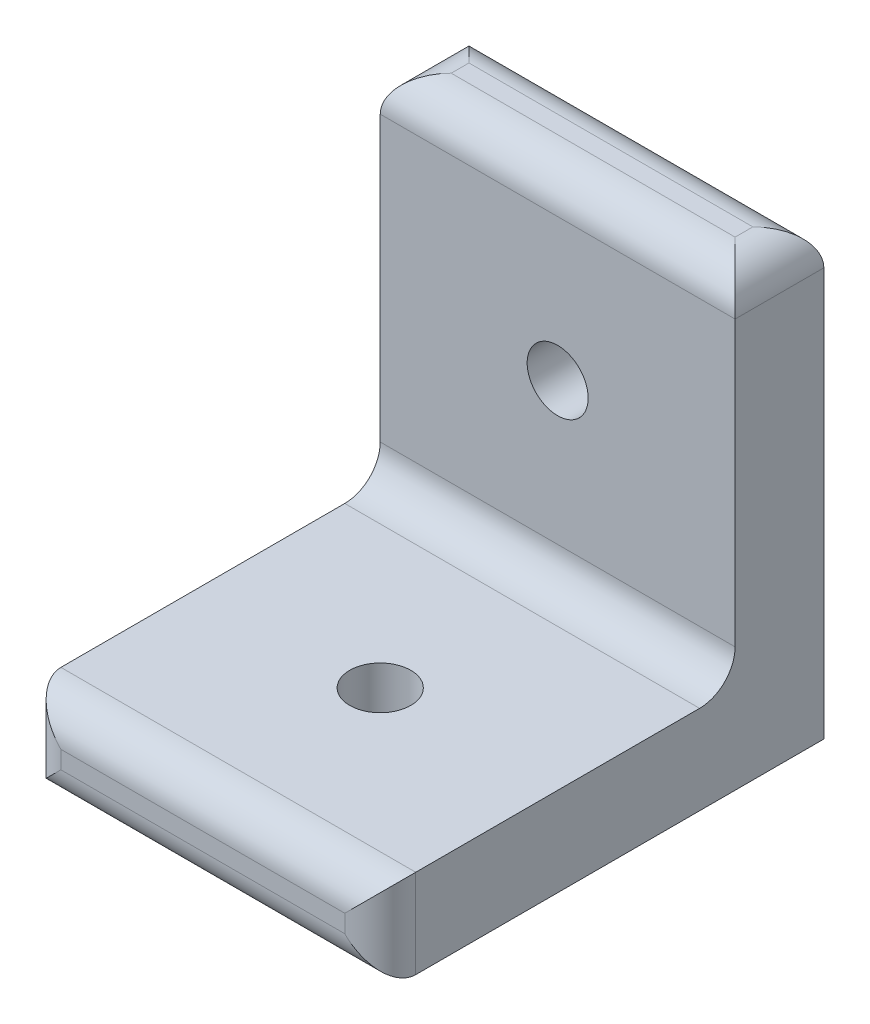
ISO-10303-21;
HEADER;
FILE_DESCRIPTION(('STEP AP214'),'2;1');
FILE_NAME('part.step','',(''),(''),'','','');
FILE_SCHEMA(('AUTOMOTIVE_DESIGN { 1 0 10303 214 1 1 1 1 }'));
ENDSEC;
DATA;
#1=APPLICATION_CONTEXT('core data for automotive mechanical design processes');
#2=APPLICATION_PROTOCOL_DEFINITION('international standard','automotive_design',2000,#1);
#3=PRODUCT_CONTEXT('',#1,'mechanical');
#4=PRODUCT('Part','Part','',(#3));
#5=PRODUCT_RELATED_PRODUCT_CATEGORY('part','',(#4));
#6=PRODUCT_DEFINITION_FORMATION('','',#4);
#7=PRODUCT_DEFINITION_CONTEXT('part definition',#1,'design');
#8=PRODUCT_DEFINITION('design','',#6,#7);
#9=PRODUCT_DEFINITION_SHAPE('','',#8);
#10=(LENGTH_UNIT() NAMED_UNIT(*) SI_UNIT(.MILLI.,.METRE.));
#11=(NAMED_UNIT(*) PLANE_ANGLE_UNIT() SI_UNIT($,.RADIAN.));
#12=(NAMED_UNIT(*) SI_UNIT($,.STERADIAN.) SOLID_ANGLE_UNIT());
#13=UNCERTAINTY_MEASURE_WITH_UNIT(LENGTH_MEASURE(1.E-05),#10,'distance_accuracy_value','');
#14=(GEOMETRIC_REPRESENTATION_CONTEXT(3) GLOBAL_UNCERTAINTY_ASSIGNED_CONTEXT((#13)) GLOBAL_UNIT_ASSIGNED_CONTEXT((#10,
#11,#12)) REPRESENTATION_CONTEXT('',''));
#15=CARTESIAN_POINT('',(0.,0.,0.));
#16=DIRECTION('',(0.,0.,1.));
#17=DIRECTION('',(1.,0.,0.));
#18=AXIS2_PLACEMENT_3D('',#15,#16,#17);
#19=CARTESIAN_POINT('',(0.,0.,-12.7));
#20=DIRECTION('',(0.,0.,-1.));
#21=DIRECTION('',(-1.,0.,0.));
#22=AXIS2_PLACEMENT_3D('',#19,#20,#21);
#23=PLANE('',#22);
#24=DIRECTION('',(0.,-1.,0.));
#25=VECTOR('',#24,1.);
#26=CARTESIAN_POINT('',(12.7,31.75,-12.7));
#27=LINE('',#26,#25);
#28=CARTESIAN_POINT('',(12.7,29.21,-12.7));
#29=VERTEX_POINT('',#28);
#30=CARTESIAN_POINT('',(12.7,8.89,-12.7));
#31=VERTEX_POINT('',#30);
#32=EDGE_CURVE('E154',#29,#31,#27,.T.);
#33=ORIENTED_EDGE('',*,*,#32,.F.);
#34=DIRECTION('',(1.,0.,0.));
#35=VECTOR('',#34,1.);
#36=CARTESIAN_POINT('',(0.,29.21,-12.7));
#37=LINE('',#36,#35);
#38=CARTESIAN_POINT('',(-12.7,29.21,-12.7));
#39=VERTEX_POINT('',#38);
#40=EDGE_CURVE('E193',#29,#39,#37,.F.);
#41=ORIENTED_EDGE('',*,*,#40,.T.);
#42=DIRECTION('',(0.,1.,0.));
#43=VECTOR('',#42,1.);
#44=CARTESIAN_POINT('',(-12.7,31.75,-12.7));
#45=LINE('',#44,#43);
#46=CARTESIAN_POINT('',(-12.7,8.89,-12.7));
#47=VERTEX_POINT('',#46);
#48=EDGE_CURVE('E151',#47,#39,#45,.T.);
#49=ORIENTED_EDGE('',*,*,#48,.F.);
#50=DIRECTION('',(-1.,0.,0.));
#51=VECTOR('',#50,1.);
#52=CARTESIAN_POINT('',(12.7,8.89,-12.7));
#53=LINE('',#52,#51);
#54=EDGE_CURVE('E191',#47,#31,#53,.F.);
#55=ORIENTED_EDGE('',*,*,#54,.T.);
#56=EDGE_LOOP('',(#33,#41,#49,#55));
#57=FACE_BOUND('',#56,.T.);
#58=CARTESIAN_POINT('',(0.,19.05,-12.7));
#59=DIRECTION('',(0.,0.,1.));
#60=DIRECTION('',(1.,0.,0.));
#61=AXIS2_PLACEMENT_3D('',#58,#59,#60);
#62=CIRCLE('',#61,2.182876);
#63=CARTESIAN_POINT('',(2.182876,19.05,-12.7));
#64=VERTEX_POINT('',#63);
#65=EDGE_CURVE('E275',#64,#64,#62,.T.);
#66=ORIENTED_EDGE('',*,*,#65,.F.);
#67=EDGE_LOOP('',(#66));
#68=FACE_BOUND('',#67,.T.);
#69=ADVANCED_FACE('F37',(#57,#68),#23,.F.);
#70=CARTESIAN_POINT('',(12.7,6.35,12.7));
#71=DIRECTION('',(-1.,0.,0.));
#72=DIRECTION('',(0.,0.,1.));
#73=AXIS2_PLACEMENT_3D('',#70,#71,#72);
#74=PLANE('',#73);
#75=DIRECTION('',(0.,-1.,0.));
#76=VECTOR('',#75,1.);
#77=CARTESIAN_POINT('',(12.7,31.75,-19.05));
#78=LINE('',#77,#76);
#79=CARTESIAN_POINT('',(12.7,29.21,-19.05));
#80=VERTEX_POINT('',#79);
#81=CARTESIAN_POINT('',(12.7,0.,-19.05));
#82=VERTEX_POINT('',#81);
#83=EDGE_CURVE('E123',#80,#82,#78,.T.);
#84=ORIENTED_EDGE('',*,*,#83,.F.);
#85=DIRECTION('',(0.,0.,1.));
#86=VECTOR('',#85,1.);
#87=CARTESIAN_POINT('',(12.7,29.21,12.7));
#88=LINE('',#87,#86);
#89=EDGE_CURVE('E181',#80,#29,#88,.T.);
#90=ORIENTED_EDGE('',*,*,#89,.T.);
#91=ORIENTED_EDGE('',*,*,#32,.T.);
#92=CARTESIAN_POINT('',(12.7,8.89,-10.16));
#93=DIRECTION('',(-1.,0.,0.));
#94=DIRECTION('',(0.,0.,1.));
#95=AXIS2_PLACEMENT_3D('',#92,#93,#94);
#96=CIRCLE('',#95,2.54);
#97=CARTESIAN_POINT('',(12.7,6.35,-10.16));
#98=VERTEX_POINT('',#97);
#99=EDGE_CURVE('E11',#31,#98,#96,.T.);
#100=ORIENTED_EDGE('',*,*,#99,.T.);
#101=DIRECTION('',(0.,0.,-1.));
#102=VECTOR('',#101,1.);
#103=CARTESIAN_POINT('',(12.7,6.35,12.7));
#104=LINE('',#103,#102);
#105=CARTESIAN_POINT('',(12.7,6.35,10.16));
#106=VERTEX_POINT('',#105);
#107=EDGE_CURVE('E158',#106,#98,#104,.T.);
#108=ORIENTED_EDGE('',*,*,#107,.F.);
#109=DIRECTION('',(0.,-1.,0.));
#110=VECTOR('',#109,1.);
#111=CARTESIAN_POINT('',(12.7,6.35,10.16));
#112=LINE('',#111,#110);
#113=CARTESIAN_POINT('',(12.7,0.,10.16));
#114=VERTEX_POINT('',#113);
#115=EDGE_CURVE('E141',#106,#114,#112,.T.);
#116=ORIENTED_EDGE('',*,*,#115,.T.);
#117=DIRECTION('',(0.,0.,-1.));
#118=VECTOR('',#117,1.);
#119=CARTESIAN_POINT('',(12.7,0.,12.7));
#120=LINE('',#119,#118);
#121=EDGE_CURVE('E137',#114,#82,#120,.T.);
#122=ORIENTED_EDGE('',*,*,#121,.T.);
#123=EDGE_LOOP('',(#84,#90,#91,#100,#108,#116,#122));
#124=FACE_BOUND('',#123,.T.);
#125=ADVANCED_FACE('F138',(#124),#74,.F.);
#126=CARTESIAN_POINT('',(-12.7,6.35,12.7));
#127=DIRECTION('',(1.,0.,0.));
#128=DIRECTION('',(0.,0.,-1.));
#129=AXIS2_PLACEMENT_3D('',#126,#127,#128);
#130=PLANE('',#129);
#131=ORIENTED_EDGE('',*,*,#48,.T.);
#132=DIRECTION('',(0.,0.,1.));
#133=VECTOR('',#132,1.);
#134=CARTESIAN_POINT('',(-12.7,29.21,12.7));
#135=LINE('',#134,#133);
#136=CARTESIAN_POINT('',(-12.7,29.21,-19.05));
#137=VERTEX_POINT('',#136);
#138=EDGE_CURVE('E177',#39,#137,#135,.F.);
#139=ORIENTED_EDGE('',*,*,#138,.T.);
#140=DIRECTION('',(0.,1.,0.));
#141=VECTOR('',#140,1.);
#142=CARTESIAN_POINT('',(-12.7,31.75,-19.05));
#143=LINE('',#142,#141);
#144=CARTESIAN_POINT('',(-12.7,0.,-19.05));
#145=VERTEX_POINT('',#144);
#146=EDGE_CURVE('E134',#145,#137,#143,.T.);
#147=ORIENTED_EDGE('',*,*,#146,.F.);
#148=DIRECTION('',(0.,0.,1.));
#149=VECTOR('',#148,1.);
#150=CARTESIAN_POINT('',(-12.7,0.,12.7));
#151=LINE('',#150,#149);
#152=CARTESIAN_POINT('',(-12.7,0.,10.16));
#153=VERTEX_POINT('',#152);
#154=EDGE_CURVE('E144',#145,#153,#151,.T.);
#155=ORIENTED_EDGE('',*,*,#154,.T.);
#156=DIRECTION('',(0.,-1.,0.));
#157=VECTOR('',#156,1.);
#158=CARTESIAN_POINT('',(-12.7,6.35,10.16));
#159=LINE('',#158,#157);
#160=CARTESIAN_POINT('',(-12.7,6.35,10.16));
#161=VERTEX_POINT('',#160);
#162=EDGE_CURVE('E174',#153,#161,#159,.F.);
#163=ORIENTED_EDGE('',*,*,#162,.T.);
#164=DIRECTION('',(0.,0.,1.));
#165=VECTOR('',#164,1.);
#166=CARTESIAN_POINT('',(-12.7,6.35,12.7));
#167=LINE('',#166,#165);
#168=CARTESIAN_POINT('',(-12.7,6.35,-10.16));
#169=VERTEX_POINT('',#168);
#170=EDGE_CURVE('E161',#169,#161,#167,.T.);
#171=ORIENTED_EDGE('',*,*,#170,.F.);
#172=CARTESIAN_POINT('',(-12.7,8.89,-10.16));
#173=DIRECTION('',(1.,0.,0.));
#174=DIRECTION('',(0.,0.,-1.));
#175=AXIS2_PLACEMENT_3D('',#172,#173,#174);
#176=CIRCLE('',#175,2.54);
#177=EDGE_CURVE('E46',#169,#47,#176,.T.);
#178=ORIENTED_EDGE('',*,*,#177,.T.);
#179=EDGE_LOOP('',(#131,#139,#147,#155,#163,#171,#178));
#180=FACE_BOUND('',#179,.T.);
#181=ADVANCED_FACE('F230',(#180),#130,.F.);
#182=CARTESIAN_POINT('',(-12.7,6.35,12.7));
#183=DIRECTION('',(0.,0.,-1.));
#184=DIRECTION('',(-1.,0.,0.));
#185=AXIS2_PLACEMENT_3D('',#182,#183,#184);
#186=PLANE('',#185);
#187=DIRECTION('',(0.,-1.,0.));
#188=VECTOR('',#187,1.);
#189=CARTESIAN_POINT('',(-10.16,6.35,12.7));
#190=LINE('',#189,#188);
#191=CARTESIAN_POINT('',(-10.16,3.81,12.7));
#192=VERTEX_POINT('',#191);
#193=CARTESIAN_POINT('',(-10.16,2.54,12.7));
#194=VERTEX_POINT('',#193);
#195=EDGE_CURVE('E187',#192,#194,#190,.T.);
#196=ORIENTED_EDGE('',*,*,#195,.T.);
#197=DIRECTION('',(1.,0.,0.));
#198=VECTOR('',#197,1.);
#199=CARTESIAN_POINT('',(12.7,2.54,12.7));
#200=LINE('',#199,#198);
#201=CARTESIAN_POINT('',(10.16,2.54,12.7));
#202=VERTEX_POINT('',#201);
#203=EDGE_CURVE('E61',#194,#202,#200,.T.);
#204=ORIENTED_EDGE('',*,*,#203,.T.);
#205=DIRECTION('',(0.,-1.,0.));
#206=VECTOR('',#205,1.);
#207=CARTESIAN_POINT('',(10.16,6.35,12.7));
#208=LINE('',#207,#206);
#209=CARTESIAN_POINT('',(10.16,3.81,12.7));
#210=VERTEX_POINT('',#209);
#211=EDGE_CURVE('E185',#202,#210,#208,.F.);
#212=ORIENTED_EDGE('',*,*,#211,.T.);
#213=DIRECTION('',(1.,0.,0.));
#214=VECTOR('',#213,1.);
#215=CARTESIAN_POINT('',(-12.7,3.81,12.7));
#216=LINE('',#215,#214);
#217=EDGE_CURVE('E183',#210,#192,#216,.F.);
#218=ORIENTED_EDGE('',*,*,#217,.T.);
#219=EDGE_LOOP('',(#196,#204,#212,#218));
#220=FACE_BOUND('',#219,.T.);
#221=ADVANCED_FACE('F233',(#220),#186,.F.);
#222=CARTESIAN_POINT('',(0.,6.35,0.));
#223=DIRECTION('',(0.,-1.,0.));
#224=DIRECTION('',(0.,0.,-1.));
#225=AXIS2_PLACEMENT_3D('',#222,#223,#224);
#226=PLANE('',#225);
#227=CARTESIAN_POINT('',(0.,6.35,0.));
#228=DIRECTION('',(0.,1.,0.));
#229=DIRECTION('',(0.,0.,1.));
#230=AXIS2_PLACEMENT_3D('',#227,#228,#229);
#231=CIRCLE('',#230,2.182876);
#232=CARTESIAN_POINT('',(0.,6.35,2.182876));
#233=VERTEX_POINT('',#232);
#234=EDGE_CURVE('E267',#233,#233,#231,.T.);
#235=ORIENTED_EDGE('',*,*,#234,.F.);
#236=EDGE_LOOP('',(#235));
#237=FACE_BOUND('',#236,.T.);
#238=ORIENTED_EDGE('',*,*,#170,.T.);
#239=DIRECTION('',(1.,0.,0.));
#240=VECTOR('',#239,1.);
#241=CARTESIAN_POINT('',(0.,6.35,10.16));
#242=LINE('',#241,#240);
#243=EDGE_CURVE('E200',#161,#106,#242,.T.);
#244=ORIENTED_EDGE('',*,*,#243,.T.);
#245=ORIENTED_EDGE('',*,*,#107,.T.);
#246=DIRECTION('',(-1.,0.,0.));
#247=VECTOR('',#246,1.);
#248=CARTESIAN_POINT('',(-12.7,6.35,-10.16));
#249=LINE('',#248,#247);
#250=EDGE_CURVE('E197',#98,#169,#249,.T.);
#251=ORIENTED_EDGE('',*,*,#250,.T.);
#252=EDGE_LOOP('',(#238,#244,#245,#251));
#253=FACE_BOUND('',#252,.T.);
#254=ADVANCED_FACE('F235',(#237,#253),#226,.F.);
#255=CARTESIAN_POINT('',(0.,0.,0.));
#256=DIRECTION('',(0.,-1.,0.));
#257=DIRECTION('',(0.,0.,-1.));
#258=AXIS2_PLACEMENT_3D('',#255,#256,#257);
#259=PLANE('',#258);
#260=CARTESIAN_POINT('',(0.,0.,0.));
#261=DIRECTION('',(0.,1.,0.));
#262=DIRECTION('',(0.,0.,1.));
#263=AXIS2_PLACEMENT_3D('',#260,#261,#262);
#264=CIRCLE('',#263,2.182876);
#265=CARTESIAN_POINT('',(0.,0.,2.182876));
#266=VERTEX_POINT('',#265);
#267=EDGE_CURVE('E214',#266,#266,#264,.T.);
#268=ORIENTED_EDGE('',*,*,#267,.T.);
#269=EDGE_LOOP('',(#268));
#270=FACE_BOUND('',#269,.T.);
#271=ORIENTED_EDGE('',*,*,#121,.F.);
#272=DIRECTION('',(1.,0.,0.));
#273=VECTOR('',#272,1.);
#274=CARTESIAN_POINT('',(-12.7,0.,10.16));
#275=LINE('',#274,#273);
#276=EDGE_CURVE('E195',#114,#153,#275,.F.);
#277=ORIENTED_EDGE('',*,*,#276,.T.);
#278=ORIENTED_EDGE('',*,*,#154,.F.);
#279=DIRECTION('',(-1.,0.,0.));
#280=VECTOR('',#279,1.);
#281=CARTESIAN_POINT('',(12.7,0.,-19.05));
#282=LINE('',#281,#280);
#283=EDGE_CURVE('E128',#82,#145,#282,.T.);
#284=ORIENTED_EDGE('',*,*,#283,.F.);
#285=EDGE_LOOP('',(#271,#277,#278,#284));
#286=FACE_BOUND('',#285,.T.);
#287=ADVANCED_FACE('F146',(#270,#286),#259,.T.);
#288=CARTESIAN_POINT('',(12.7,31.75,-19.05));
#289=DIRECTION('',(0.,-1.,0.));
#290=DIRECTION('',(0.,0.,-1.));
#291=AXIS2_PLACEMENT_3D('',#288,#289,#290);
#292=PLANE('',#291);
#293=DIRECTION('',(0.,0.,1.));
#294=VECTOR('',#293,1.);
#295=CARTESIAN_POINT('',(10.16,31.75,-19.05));
#296=LINE('',#295,#294);
#297=CARTESIAN_POINT('',(10.16,31.75,-15.24));
#298=VERTEX_POINT('',#297);
#299=CARTESIAN_POINT('',(10.16,31.75,-16.51));
#300=VERTEX_POINT('',#299);
#301=EDGE_CURVE('E167',#298,#300,#296,.F.);
#302=ORIENTED_EDGE('',*,*,#301,.T.);
#303=DIRECTION('',(1.,0.,0.));
#304=VECTOR('',#303,1.);
#305=CARTESIAN_POINT('',(-12.7,31.75,-16.51));
#306=LINE('',#305,#304);
#307=CARTESIAN_POINT('',(-10.16,31.75,-16.51));
#308=VERTEX_POINT('',#307);
#309=EDGE_CURVE('E172',#300,#308,#306,.F.);
#310=ORIENTED_EDGE('',*,*,#309,.T.);
#311=DIRECTION('',(0.,0.,1.));
#312=VECTOR('',#311,1.);
#313=CARTESIAN_POINT('',(-10.16,31.75,-19.05));
#314=LINE('',#313,#312);
#315=CARTESIAN_POINT('',(-10.16,31.75,-15.24));
#316=VERTEX_POINT('',#315);
#317=EDGE_CURVE('E169',#308,#316,#314,.T.);
#318=ORIENTED_EDGE('',*,*,#317,.T.);
#319=DIRECTION('',(1.,0.,0.));
#320=VECTOR('',#319,1.);
#321=CARTESIAN_POINT('',(12.7,31.75,-15.24));
#322=LINE('',#321,#320);
#323=EDGE_CURVE('E163',#316,#298,#322,.T.);
#324=ORIENTED_EDGE('',*,*,#323,.T.);
#325=EDGE_LOOP('',(#302,#310,#318,#324));
#326=FACE_BOUND('',#325,.T.);
#327=ADVANCED_FACE('F257',(#326),#292,.F.);
#328=CARTESIAN_POINT('',(0.,0.,-19.05));
#329=DIRECTION('',(0.,0.,-1.));
#330=DIRECTION('',(-1.,0.,0.));
#331=AXIS2_PLACEMENT_3D('',#328,#329,#330);
#332=PLANE('',#331);
#333=CARTESIAN_POINT('',(0.,19.05,-19.05));
#334=DIRECTION('',(0.,0.,1.));
#335=DIRECTION('',(1.,0.,0.));
#336=AXIS2_PLACEMENT_3D('',#333,#334,#335);
#337=CIRCLE('',#336,2.182876);
#338=CARTESIAN_POINT('',(2.182876,19.05,-19.05));
#339=VERTEX_POINT('',#338);
#340=EDGE_CURVE('E270',#339,#339,#337,.T.);
#341=ORIENTED_EDGE('',*,*,#340,.T.);
#342=EDGE_LOOP('',(#341));
#343=FACE_BOUND('',#342,.T.);
#344=ORIENTED_EDGE('',*,*,#146,.T.);
#345=DIRECTION('',(1.,0.,0.));
#346=VECTOR('',#345,1.);
#347=CARTESIAN_POINT('',(12.7,29.21,-19.05));
#348=LINE('',#347,#346);
#349=EDGE_CURVE('E131',#137,#80,#348,.T.);
#350=ORIENTED_EDGE('',*,*,#349,.T.);
#351=ORIENTED_EDGE('',*,*,#83,.T.);
#352=ORIENTED_EDGE('',*,*,#283,.T.);
#353=EDGE_LOOP('',(#344,#350,#351,#352));
#354=FACE_BOUND('',#353,.T.);
#355=ADVANCED_FACE('F126',(#343,#354),#332,.T.);
#356=CARTESIAN_POINT('',(10.16,29.21,12.7));
#357=DIRECTION('',(0.,0.,1.));
#358=DIRECTION('',(1.,0.,0.));
#359=AXIS2_PLACEMENT_3D('',#356,#357,#358);
#360=CYLINDRICAL_SURFACE('',#359,2.54);
#361=CARTESIAN_POINT('',(10.16,29.21,-15.24));
#362=DIRECTION('',(0.707106781186547,0.,-0.707106781186547));
#363=DIRECTION('',(0.707106781186547,0.,0.707106781186547));
#364=AXIS2_PLACEMENT_3D('',#361,#362,#363);
#365=ELLIPSE('',#364,3.59210244842766,2.54);
#366=EDGE_CURVE('E207',#29,#298,#365,.F.);
#367=ORIENTED_EDGE('',*,*,#366,.F.);
#368=ORIENTED_EDGE('',*,*,#89,.F.);
#369=CARTESIAN_POINT('',(10.16,29.21,-16.51));
#370=DIRECTION('',(-0.707106781186547,0.,-0.707106781186547));
#371=DIRECTION('',(-0.707106781186547,0.,0.707106781186547));
#372=AXIS2_PLACEMENT_3D('',#369,#370,#371);
#373=ELLIPSE('',#372,3.59210244842766,2.54);
#374=EDGE_CURVE('E155',#300,#80,#373,.T.);
#375=ORIENTED_EDGE('',*,*,#374,.F.);
#376=ORIENTED_EDGE('',*,*,#301,.F.);
#377=EDGE_LOOP('',(#367,#368,#375,#376));
#378=FACE_BOUND('',#377,.T.);
#379=ADVANCED_FACE('F290',(#378),#360,.T.);
#380=CARTESIAN_POINT('',(0.,29.21,-16.51));
#381=DIRECTION('',(-1.,0.,0.));
#382=DIRECTION('',(0.,0.,1.));
#383=AXIS2_PLACEMENT_3D('',#380,#381,#382);
#384=CYLINDRICAL_SURFACE('',#383,2.54);
#385=ORIENTED_EDGE('',*,*,#374,.T.);
#386=ORIENTED_EDGE('',*,*,#349,.F.);
#387=CARTESIAN_POINT('',(-10.16,29.21,-16.51));
#388=DIRECTION('',(-0.707106781186547,0.,0.707106781186547));
#389=DIRECTION('',(-0.707106781186547,0.,-0.707106781186547));
#390=AXIS2_PLACEMENT_3D('',#387,#388,#389);
#391=ELLIPSE('',#390,3.59210244842766,2.54);
#392=EDGE_CURVE('E205',#308,#137,#391,.T.);
#393=ORIENTED_EDGE('',*,*,#392,.F.);
#394=ORIENTED_EDGE('',*,*,#309,.F.);
#395=EDGE_LOOP('',(#385,#386,#393,#394));
#396=FACE_BOUND('',#395,.T.);
#397=ADVANCED_FACE('F294',(#396),#384,.T.);
#398=CARTESIAN_POINT('',(12.7,29.21,-15.24));
#399=DIRECTION('',(1.,0.,0.));
#400=DIRECTION('',(0.,0.,-1.));
#401=AXIS2_PLACEMENT_3D('',#398,#399,#400);
#402=CYLINDRICAL_SURFACE('',#401,2.54);
#403=ORIENTED_EDGE('',*,*,#366,.T.);
#404=ORIENTED_EDGE('',*,*,#323,.F.);
#405=CARTESIAN_POINT('',(-10.16,29.21,-15.24));
#406=DIRECTION('',(0.707106781186547,0.,0.707106781186547));
#407=DIRECTION('',(0.707106781186547,0.,-0.707106781186547));
#408=AXIS2_PLACEMENT_3D('',#405,#406,#407);
#409=ELLIPSE('',#408,3.59210244842766,2.54);
#410=EDGE_CURVE('E203',#39,#316,#409,.F.);
#411=ORIENTED_EDGE('',*,*,#410,.F.);
#412=ORIENTED_EDGE('',*,*,#40,.F.);
#413=EDGE_LOOP('',(#403,#404,#411,#412));
#414=FACE_BOUND('',#413,.T.);
#415=ADVANCED_FACE('F300',(#414),#402,.T.);
#416=CARTESIAN_POINT('',(-10.16,29.21,-19.05));
#417=DIRECTION('',(0.,0.,1.));
#418=DIRECTION('',(1.,0.,0.));
#419=AXIS2_PLACEMENT_3D('',#416,#417,#418);
#420=CYLINDRICAL_SURFACE('',#419,2.54);
#421=ORIENTED_EDGE('',*,*,#392,.T.);
#422=ORIENTED_EDGE('',*,*,#138,.F.);
#423=ORIENTED_EDGE('',*,*,#410,.T.);
#424=ORIENTED_EDGE('',*,*,#317,.F.);
#425=EDGE_LOOP('',(#421,#422,#423,#424));
#426=FACE_BOUND('',#425,.T.);
#427=ADVANCED_FACE('F312',(#426),#420,.T.);
#428=CARTESIAN_POINT('',(10.16,6.35,10.16));
#429=DIRECTION('',(0.,-1.,0.));
#430=DIRECTION('',(0.,0.,-1.));
#431=AXIS2_PLACEMENT_3D('',#428,#429,#430);
#432=CYLINDRICAL_SURFACE('',#431,2.54);
#433=CARTESIAN_POINT('',(10.16,2.54,10.16));
#434=DIRECTION('',(-0.707106781186547,-0.707106781186547,0.));
#435=DIRECTION('',(-0.707106781186547,0.707106781186547,0.));
#436=AXIS2_PLACEMENT_3D('',#433,#434,#435);
#437=ELLIPSE('',#436,3.59210244842766,2.54);
#438=EDGE_CURVE('E215',#114,#202,#437,.T.);
#439=ORIENTED_EDGE('',*,*,#438,.F.);
#440=ORIENTED_EDGE('',*,*,#115,.F.);
#441=CARTESIAN_POINT('',(10.16,3.81,10.16));
#442=DIRECTION('',(0.707106781186547,-0.707106781186547,0.));
#443=DIRECTION('',(0.707106781186547,0.707106781186547,0.));
#444=AXIS2_PLACEMENT_3D('',#441,#442,#443);
#445=ELLIPSE('',#444,3.59210244842766,2.54);
#446=EDGE_CURVE('E41',#210,#106,#445,.F.);
#447=ORIENTED_EDGE('',*,*,#446,.F.);
#448=ORIENTED_EDGE('',*,*,#211,.F.);
#449=EDGE_LOOP('',(#439,#440,#447,#448));
#450=FACE_BOUND('',#449,.T.);
#451=ADVANCED_FACE('F227',(#450),#432,.T.);
#452=CARTESIAN_POINT('',(0.,3.81,10.16));
#453=DIRECTION('',(1.,0.,0.));
#454=DIRECTION('',(0.,0.,-1.));
#455=AXIS2_PLACEMENT_3D('',#452,#453,#454);
#456=CYLINDRICAL_SURFACE('',#455,2.54);
#457=ORIENTED_EDGE('',*,*,#446,.T.);
#458=ORIENTED_EDGE('',*,*,#243,.F.);
#459=CARTESIAN_POINT('',(-10.16,3.81,10.16));
#460=DIRECTION('',(0.707106781186547,0.707106781186547,0.));
#461=DIRECTION('',(0.707106781186547,-0.707106781186547,0.));
#462=AXIS2_PLACEMENT_3D('',#459,#460,#461);
#463=ELLIPSE('',#462,3.59210244842766,2.54);
#464=EDGE_CURVE('E213',#192,#161,#463,.F.);
#465=ORIENTED_EDGE('',*,*,#464,.F.);
#466=ORIENTED_EDGE('',*,*,#217,.F.);
#467=EDGE_LOOP('',(#457,#458,#465,#466));
#468=FACE_BOUND('',#467,.T.);
#469=ADVANCED_FACE('F224',(#468),#456,.T.);
#470=CARTESIAN_POINT('',(-12.7,2.54,10.16));
#471=DIRECTION('',(-1.,0.,0.));
#472=DIRECTION('',(0.,0.,1.));
#473=AXIS2_PLACEMENT_3D('',#470,#471,#472);
#474=CYLINDRICAL_SURFACE('',#473,2.54);
#475=ORIENTED_EDGE('',*,*,#438,.T.);
#476=ORIENTED_EDGE('',*,*,#203,.F.);
#477=CARTESIAN_POINT('',(-10.16,2.54,10.16));
#478=DIRECTION('',(-0.707106781186547,0.707106781186547,0.));
#479=DIRECTION('',(-0.707106781186547,-0.707106781186547,0.));
#480=AXIS2_PLACEMENT_3D('',#477,#478,#479);
#481=ELLIPSE('',#480,3.59210244842766,2.54);
#482=EDGE_CURVE('E54',#153,#194,#481,.T.);
#483=ORIENTED_EDGE('',*,*,#482,.F.);
#484=ORIENTED_EDGE('',*,*,#276,.F.);
#485=EDGE_LOOP('',(#475,#476,#483,#484));
#486=FACE_BOUND('',#485,.T.);
#487=ADVANCED_FACE('F228',(#486),#474,.T.);
#488=CARTESIAN_POINT('',(-10.16,6.35,10.16));
#489=DIRECTION('',(0.,-1.,0.));
#490=DIRECTION('',(0.,0.,-1.));
#491=AXIS2_PLACEMENT_3D('',#488,#489,#490);
#492=CYLINDRICAL_SURFACE('',#491,2.54);
#493=ORIENTED_EDGE('',*,*,#464,.T.);
#494=ORIENTED_EDGE('',*,*,#162,.F.);
#495=ORIENTED_EDGE('',*,*,#482,.T.);
#496=ORIENTED_EDGE('',*,*,#195,.F.);
#497=EDGE_LOOP('',(#493,#494,#495,#496));
#498=FACE_BOUND('',#497,.T.);
#499=ADVANCED_FACE('F232',(#498),#492,.T.);
#500=CARTESIAN_POINT('',(0.,8.89,-10.16));
#501=DIRECTION('',(1.,0.,0.));
#502=DIRECTION('',(0.,0.,-1.));
#503=AXIS2_PLACEMENT_3D('',#500,#501,#502);
#504=CYLINDRICAL_SURFACE('',#503,2.54);
#505=ORIENTED_EDGE('',*,*,#99,.F.);
#506=ORIENTED_EDGE('',*,*,#54,.F.);
#507=ORIENTED_EDGE('',*,*,#177,.F.);
#508=ORIENTED_EDGE('',*,*,#250,.F.);
#509=EDGE_LOOP('',(#505,#506,#507,#508));
#510=FACE_BOUND('',#509,.T.);
#511=ADVANCED_FACE('F39',(#510),#504,.F.);
#512=CARTESIAN_POINT('',(0.,6.35,0.));
#513=DIRECTION('',(0.,1.,0.));
#514=DIRECTION('',(0.,0.,1.));
#515=AXIS2_PLACEMENT_3D('',#512,#513,#514);
#516=CYLINDRICAL_SURFACE('',#515,2.182876);
#517=ORIENTED_EDGE('',*,*,#267,.F.);
#518=EDGE_LOOP('',(#517));
#519=FACE_BOUND('',#518,.T.);
#520=ORIENTED_EDGE('',*,*,#234,.T.);
#521=EDGE_LOOP('',(#520));
#522=FACE_BOUND('',#521,.T.);
#523=ADVANCED_FACE('F281',(#519,#522),#516,.F.);
#524=CARTESIAN_POINT('',(0.,19.05,-12.7));
#525=DIRECTION('',(0.,0.,1.));
#526=DIRECTION('',(1.,0.,0.));
#527=AXIS2_PLACEMENT_3D('',#524,#525,#526);
#528=CYLINDRICAL_SURFACE('',#527,2.182876);
#529=ORIENTED_EDGE('',*,*,#340,.F.);
#530=EDGE_LOOP('',(#529));
#531=FACE_BOUND('',#530,.T.);
#532=ORIENTED_EDGE('',*,*,#65,.T.);
#533=EDGE_LOOP('',(#532));
#534=FACE_BOUND('',#533,.T.);
#535=ADVANCED_FACE('F279',(#531,#534),#528,.F.);
#536=CLOSED_SHELL('',(#69,#125,#181,#221,#254,#287,#327,#355,#379,#397,#415,#427,#451,#469,#487,
#499,#511,#523,#535));
#537=MANIFOLD_SOLID_BREP('B2',#536);
#538=ADVANCED_BREP_SHAPE_REPRESENTATION('',(#18,#537),#14);
#539=SHAPE_DEFINITION_REPRESENTATION(#9,#538);
ENDSEC;
END-ISO-10303-21;
